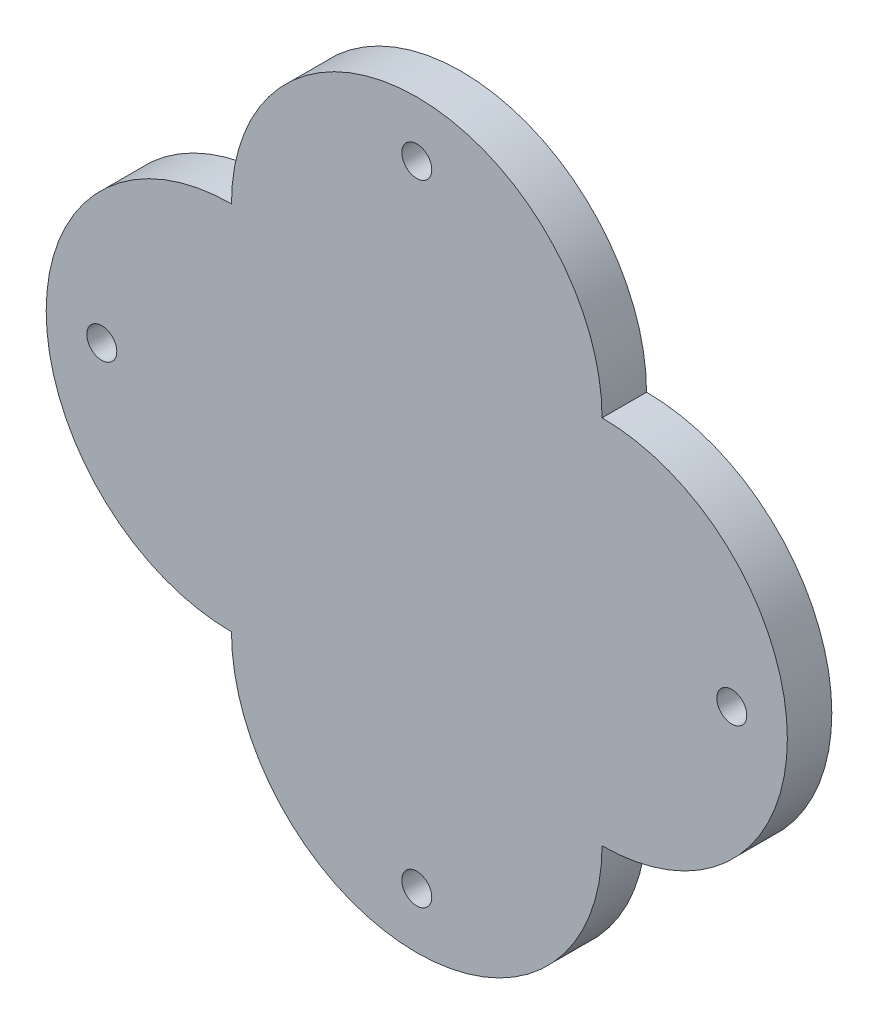
ISO-10303-21;
HEADER;
FILE_DESCRIPTION(('STEP AP214'),'2;1');
FILE_NAME('part.step','',(''),(''),'','','');
FILE_SCHEMA(('AUTOMOTIVE_DESIGN { 1 0 10303 214 1 1 1 1 }'));
ENDSEC;
DATA;
#1=APPLICATION_CONTEXT('core data for automotive mechanical design processes');
#2=APPLICATION_PROTOCOL_DEFINITION('international standard','automotive_design',2000,#1);
#3=PRODUCT_CONTEXT('',#1,'mechanical');
#4=PRODUCT('Part','Part','',(#3));
#5=PRODUCT_RELATED_PRODUCT_CATEGORY('part','',(#4));
#6=PRODUCT_DEFINITION_FORMATION('','',#4);
#7=PRODUCT_DEFINITION_CONTEXT('part definition',#1,'design');
#8=PRODUCT_DEFINITION('design','',#6,#7);
#9=PRODUCT_DEFINITION_SHAPE('','',#8);
#10=(LENGTH_UNIT() NAMED_UNIT(*) SI_UNIT(.MILLI.,.METRE.));
#11=(NAMED_UNIT(*) PLANE_ANGLE_UNIT() SI_UNIT($,.RADIAN.));
#12=(NAMED_UNIT(*) SI_UNIT($,.STERADIAN.) SOLID_ANGLE_UNIT());
#13=UNCERTAINTY_MEASURE_WITH_UNIT(LENGTH_MEASURE(1.E-05),#10,'distance_accuracy_value','');
#14=(GEOMETRIC_REPRESENTATION_CONTEXT(3) GLOBAL_UNCERTAINTY_ASSIGNED_CONTEXT((#13)) GLOBAL_UNIT_ASSIGNED_CONTEXT((#10,
#11,#12)) REPRESENTATION_CONTEXT('',''));
#15=CARTESIAN_POINT('',(0.,0.,0.));
#16=DIRECTION('',(0.,0.,1.));
#17=DIRECTION('',(1.,0.,0.));
#18=AXIS2_PLACEMENT_3D('',#15,#16,#17);
#19=CARTESIAN_POINT('',(-79.4444444444444,-4.40613026819923,12.));
#20=DIRECTION('',(0.,0.,-1.));
#21=DIRECTION('',(-1.,0.,0.));
#22=AXIS2_PLACEMENT_3D('',#19,#20,#21);
#23=CYLINDRICAL_SURFACE('',#22,9.49999999999999);
#24=CARTESIAN_POINT('',(-79.4444444444444,-4.40613026819923,0.));
#25=DIRECTION('',(0.,0.,1.));
#26=DIRECTION('',(1.,0.,0.));
#27=AXIS2_PLACEMENT_3D('',#24,#25,#26);
#28=CIRCLE('',#27,9.49999999999999);
#29=CARTESIAN_POINT('',(-69.9444444444444,-4.40613026819923,0.));
#30=VERTEX_POINT('',#29);
#31=EDGE_CURVE('E101',#30,#30,#28,.T.);
#32=ORIENTED_EDGE('',*,*,#31,.F.);
#33=EDGE_LOOP('',(#32));
#34=FACE_BOUND('',#33,.T.);
#35=CARTESIAN_POINT('',(-79.4444444444444,-4.40613026819923,6.));
#36=DIRECTION('',(0.,0.,1.));
#37=DIRECTION('',(1.,0.,0.));
#38=AXIS2_PLACEMENT_3D('',#35,#36,#37);
#39=CIRCLE('',#38,9.5);
#40=CARTESIAN_POINT('',(-69.9444444444444,-4.40613026819923,6.));
#41=VERTEX_POINT('',#40);
#42=EDGE_CURVE('E149',#41,#41,#39,.T.);
#43=ORIENTED_EDGE('',*,*,#42,.T.);
#44=EDGE_LOOP('',(#43));
#45=FACE_BOUND('',#44,.T.);
#46=ADVANCED_FACE('F33',(#34,#45),#23,.F.);
#47=CARTESIAN_POINT('',(5.55555555555558,-89.4061302681992,12.));
#48=DIRECTION('',(0.,0.,-1.));
#49=DIRECTION('',(-1.,0.,0.));
#50=AXIS2_PLACEMENT_3D('',#47,#48,#49);
#51=CYLINDRICAL_SURFACE('',#50,9.5);
#52=CARTESIAN_POINT('',(5.55555555555558,-89.4061302681992,0.));
#53=DIRECTION('',(0.,0.,1.));
#54=DIRECTION('',(1.,0.,0.));
#55=AXIS2_PLACEMENT_3D('',#52,#53,#54);
#56=CIRCLE('',#55,9.5);
#57=CARTESIAN_POINT('',(15.0555555555556,-89.4061302681992,0.));
#58=VERTEX_POINT('',#57);
#59=EDGE_CURVE('E121',#58,#58,#56,.T.);
#60=ORIENTED_EDGE('',*,*,#59,.F.);
#61=EDGE_LOOP('',(#60));
#62=FACE_BOUND('',#61,.T.);
#63=CARTESIAN_POINT('',(5.55555555555558,-89.4061302681992,6.));
#64=DIRECTION('',(0.,0.,1.));
#65=DIRECTION('',(1.,0.,0.));
#66=AXIS2_PLACEMENT_3D('',#63,#64,#65);
#67=CIRCLE('',#66,9.49999999999999);
#68=CARTESIAN_POINT('',(15.0555555555556,-89.4061302681992,6.));
#69=VERTEX_POINT('',#68);
#70=EDGE_CURVE('E140',#69,#69,#67,.T.);
#71=ORIENTED_EDGE('',*,*,#70,.T.);
#72=EDGE_LOOP('',(#71));
#73=FACE_BOUND('',#72,.T.);
#74=ADVANCED_FACE('F185',(#62,#73),#51,.F.);
#75=CARTESIAN_POINT('',(90.5555555555556,-4.40613026819923,12.));
#76=DIRECTION('',(0.,0.,-1.));
#77=DIRECTION('',(-1.,0.,0.));
#78=AXIS2_PLACEMENT_3D('',#75,#76,#77);
#79=CYLINDRICAL_SURFACE('',#78,9.49999999999999);
#80=CARTESIAN_POINT('',(90.5555555555556,-4.40613026819923,0.));
#81=DIRECTION('',(0.,0.,1.));
#82=DIRECTION('',(1.,0.,0.));
#83=AXIS2_PLACEMENT_3D('',#80,#81,#82);
#84=CIRCLE('',#83,9.49999999999999);
#85=CARTESIAN_POINT('',(100.055555555556,-4.40613026819923,0.));
#86=VERTEX_POINT('',#85);
#87=EDGE_CURVE('E118',#86,#86,#84,.T.);
#88=ORIENTED_EDGE('',*,*,#87,.F.);
#89=EDGE_LOOP('',(#88));
#90=FACE_BOUND('',#89,.T.);
#91=CARTESIAN_POINT('',(90.5555555555556,-4.40613026819923,6.));
#92=DIRECTION('',(0.,0.,1.));
#93=DIRECTION('',(1.,0.,0.));
#94=AXIS2_PLACEMENT_3D('',#91,#92,#93);
#95=CIRCLE('',#94,9.5);
#96=CARTESIAN_POINT('',(100.055555555556,-4.40613026819923,6.));
#97=VERTEX_POINT('',#96);
#98=EDGE_CURVE('E131',#97,#97,#95,.T.);
#99=ORIENTED_EDGE('',*,*,#98,.T.);
#100=EDGE_LOOP('',(#99));
#101=FACE_BOUND('',#100,.T.);
#102=ADVANCED_FACE('F180',(#90,#101),#79,.F.);
#103=CARTESIAN_POINT('',(5.55555555555557,80.5938697318008,12.));
#104=DIRECTION('',(0.,0.,-1.));
#105=DIRECTION('',(-1.,0.,0.));
#106=AXIS2_PLACEMENT_3D('',#103,#104,#105);
#107=CYLINDRICAL_SURFACE('',#106,9.5);
#108=CARTESIAN_POINT('',(5.55555555555557,80.5938697318008,0.));
#109=DIRECTION('',(0.,0.,1.));
#110=DIRECTION('',(1.,0.,0.));
#111=AXIS2_PLACEMENT_3D('',#108,#109,#110);
#112=CIRCLE('',#111,9.5);
#113=CARTESIAN_POINT('',(15.0555555555556,80.5938697318008,0.));
#114=VERTEX_POINT('',#113);
#115=EDGE_CURVE('E115',#114,#114,#112,.T.);
#116=ORIENTED_EDGE('',*,*,#115,.F.);
#117=EDGE_LOOP('',(#116));
#118=FACE_BOUND('',#117,.T.);
#119=CARTESIAN_POINT('',(5.55555555555557,80.5938697318008,6.));
#120=DIRECTION('',(0.,0.,1.));
#121=DIRECTION('',(1.,0.,0.));
#122=AXIS2_PLACEMENT_3D('',#119,#120,#121);
#123=CIRCLE('',#122,9.50000000000001);
#124=CARTESIAN_POINT('',(15.0555555555556,80.5938697318008,6.));
#125=VERTEX_POINT('',#124);
#126=EDGE_CURVE('E124',#125,#125,#123,.T.);
#127=ORIENTED_EDGE('',*,*,#126,.T.);
#128=EDGE_LOOP('',(#127));
#129=FACE_BOUND('',#128,.T.);
#130=ADVANCED_FACE('F171',(#118,#129),#107,.F.);
#131=CARTESIAN_POINT('',(-19.4444444444444,-29.4061302681992,12.));
#132=DIRECTION('',(0.,0.,1.));
#133=DIRECTION('',(1.,0.,0.));
#134=AXIS2_PLACEMENT_3D('',#131,#132,#133);
#135=PLANE('',#134);
#136=CARTESIAN_POINT('',(-44.4444444444444,-4.40613026819923,12.));
#137=DIRECTION('',(0.,0.,1.));
#138=DIRECTION('',(1.,0.,0.));
#139=AXIS2_PLACEMENT_3D('',#136,#137,#138);
#140=CIRCLE('',#139,50.);
#141=CARTESIAN_POINT('',(-44.4444444444444,45.5938697318008,12.));
#142=VERTEX_POINT('',#141);
#143=CARTESIAN_POINT('',(-44.4444444444444,-54.4061302681992,12.));
#144=VERTEX_POINT('',#143);
#145=EDGE_CURVE('E86',#142,#144,#140,.T.);
#146=ORIENTED_EDGE('',*,*,#145,.T.);
#147=CARTESIAN_POINT('',(5.55555555555558,-54.4061302681992,12.));
#148=DIRECTION('',(0.,0.,1.));
#149=DIRECTION('',(1.,0.,0.));
#150=AXIS2_PLACEMENT_3D('',#147,#148,#149);
#151=CIRCLE('',#150,50.);
#152=CARTESIAN_POINT('',(55.5555555555556,-54.4061302681992,12.));
#153=VERTEX_POINT('',#152);
#154=EDGE_CURVE('E80',#144,#153,#151,.T.);
#155=ORIENTED_EDGE('',*,*,#154,.T.);
#156=CARTESIAN_POINT('',(55.5555555555556,-4.40613026819923,12.));
#157=DIRECTION('',(0.,0.,1.));
#158=DIRECTION('',(1.,0.,0.));
#159=AXIS2_PLACEMENT_3D('',#156,#157,#158);
#160=CIRCLE('',#159,50.);
#161=CARTESIAN_POINT('',(55.5555555555556,45.5938697318008,12.));
#162=VERTEX_POINT('',#161);
#163=EDGE_CURVE('E84',#153,#162,#160,.T.);
#164=ORIENTED_EDGE('',*,*,#163,.T.);
#165=CARTESIAN_POINT('',(5.55555555555557,45.5938697318008,12.));
#166=DIRECTION('',(0.,0.,1.));
#167=DIRECTION('',(1.,0.,0.));
#168=AXIS2_PLACEMENT_3D('',#165,#166,#167);
#169=CIRCLE('',#168,50.);
#170=EDGE_CURVE('E50',#162,#142,#169,.T.);
#171=ORIENTED_EDGE('',*,*,#170,.T.);
#172=EDGE_LOOP('',(#146,#155,#164,#171));
#173=FACE_BOUND('',#172,.T.);
#174=CARTESIAN_POINT('',(5.55555555555557,80.5938697318008,12.));
#175=DIRECTION('',(0.,0.,1.));
#176=DIRECTION('',(1.,0.,0.));
#177=AXIS2_PLACEMENT_3D('',#174,#175,#176);
#178=CIRCLE('',#177,4.05);
#179=CARTESIAN_POINT('',(9.60555555555557,80.5938697318008,12.));
#180=VERTEX_POINT('',#179);
#181=EDGE_CURVE('E128',#180,#180,#178,.T.);
#182=ORIENTED_EDGE('',*,*,#181,.F.);
#183=EDGE_LOOP('',(#182));
#184=FACE_BOUND('',#183,.T.);
#185=CARTESIAN_POINT('',(90.5555555555556,-4.40613026819923,12.));
#186=DIRECTION('',(0.,0.,1.));
#187=DIRECTION('',(1.,0.,0.));
#188=AXIS2_PLACEMENT_3D('',#185,#186,#187);
#189=CIRCLE('',#188,4.05);
#190=CARTESIAN_POINT('',(94.6055555555556,-4.40613026819923,12.));
#191=VERTEX_POINT('',#190);
#192=EDGE_CURVE('E137',#191,#191,#189,.T.);
#193=ORIENTED_EDGE('',*,*,#192,.F.);
#194=EDGE_LOOP('',(#193));
#195=FACE_BOUND('',#194,.T.);
#196=CARTESIAN_POINT('',(5.55555555555558,-89.4061302681992,12.));
#197=DIRECTION('',(0.,0.,1.));
#198=DIRECTION('',(1.,0.,0.));
#199=AXIS2_PLACEMENT_3D('',#196,#197,#198);
#200=CIRCLE('',#199,4.05);
#201=CARTESIAN_POINT('',(9.60555555555558,-89.4061302681992,12.));
#202=VERTEX_POINT('',#201);
#203=EDGE_CURVE('E146',#202,#202,#200,.T.);
#204=ORIENTED_EDGE('',*,*,#203,.F.);
#205=EDGE_LOOP('',(#204));
#206=FACE_BOUND('',#205,.T.);
#207=CARTESIAN_POINT('',(-79.4444444444444,-4.40613026819923,12.));
#208=DIRECTION('',(0.,0.,1.));
#209=DIRECTION('',(1.,0.,0.));
#210=AXIS2_PLACEMENT_3D('',#207,#208,#209);
#211=CIRCLE('',#210,4.05);
#212=CARTESIAN_POINT('',(-75.3944444444444,-4.40613026819923,12.));
#213=VERTEX_POINT('',#212);
#214=EDGE_CURVE('E155',#213,#213,#211,.T.);
#215=ORIENTED_EDGE('',*,*,#214,.F.);
#216=EDGE_LOOP('',(#215));
#217=FACE_BOUND('',#216,.T.);
#218=ADVANCED_FACE('F81',(#173,#184,#195,#206,#217),#135,.T.);
#219=CARTESIAN_POINT('',(-19.4444444444444,-29.4061302681992,0.));
#220=DIRECTION('',(0.,0.,1.));
#221=DIRECTION('',(1.,0.,0.));
#222=AXIS2_PLACEMENT_3D('',#219,#220,#221);
#223=PLANE('',#222);
#224=CARTESIAN_POINT('',(-44.4444444444444,-4.40613026819923,0.));
#225=DIRECTION('',(0.,0.,1.));
#226=DIRECTION('',(1.,0.,0.));
#227=AXIS2_PLACEMENT_3D('',#224,#225,#226);
#228=CIRCLE('',#227,50.);
#229=CARTESIAN_POINT('',(-44.4444444444444,45.5938697318008,0.));
#230=VERTEX_POINT('',#229);
#231=CARTESIAN_POINT('',(-44.4444444444444,-54.4061302681992,0.));
#232=VERTEX_POINT('',#231);
#233=EDGE_CURVE('E98',#230,#232,#228,.T.);
#234=ORIENTED_EDGE('',*,*,#233,.F.);
#235=CARTESIAN_POINT('',(5.55555555555557,45.5938697318008,0.));
#236=DIRECTION('',(0.,0.,1.));
#237=DIRECTION('',(1.,0.,0.));
#238=AXIS2_PLACEMENT_3D('',#235,#236,#237);
#239=CIRCLE('',#238,50.);
#240=CARTESIAN_POINT('',(55.5555555555556,45.5938697318008,0.));
#241=VERTEX_POINT('',#240);
#242=EDGE_CURVE('E73',#241,#230,#239,.T.);
#243=ORIENTED_EDGE('',*,*,#242,.F.);
#244=CARTESIAN_POINT('',(55.5555555555556,-4.40613026819923,0.));
#245=DIRECTION('',(0.,0.,1.));
#246=DIRECTION('',(1.,0.,0.));
#247=AXIS2_PLACEMENT_3D('',#244,#245,#246);
#248=CIRCLE('',#247,50.);
#249=CARTESIAN_POINT('',(55.5555555555556,-54.4061302681992,0.));
#250=VERTEX_POINT('',#249);
#251=EDGE_CURVE('E67',#250,#241,#248,.T.);
#252=ORIENTED_EDGE('',*,*,#251,.F.);
#253=CARTESIAN_POINT('',(5.55555555555558,-54.4061302681992,0.));
#254=DIRECTION('',(0.,0.,1.));
#255=DIRECTION('',(1.,0.,0.));
#256=AXIS2_PLACEMENT_3D('',#253,#254,#255);
#257=CIRCLE('',#256,50.);
#258=EDGE_CURVE('E90',#232,#250,#257,.T.);
#259=ORIENTED_EDGE('',*,*,#258,.F.);
#260=EDGE_LOOP('',(#234,#243,#252,#259));
#261=FACE_BOUND('',#260,.T.);
#262=ORIENTED_EDGE('',*,*,#31,.T.);
#263=EDGE_LOOP('',(#262));
#264=FACE_BOUND('',#263,.T.);
#265=ORIENTED_EDGE('',*,*,#115,.T.);
#266=EDGE_LOOP('',(#265));
#267=FACE_BOUND('',#266,.T.);
#268=ORIENTED_EDGE('',*,*,#87,.T.);
#269=EDGE_LOOP('',(#268));
#270=FACE_BOUND('',#269,.T.);
#271=ORIENTED_EDGE('',*,*,#59,.T.);
#272=EDGE_LOOP('',(#271));
#273=FACE_BOUND('',#272,.T.);
#274=ADVANCED_FACE('F109',(#261,#264,#267,#270,#273),#223,.F.);
#275=CARTESIAN_POINT('',(-44.4444444444444,-4.40613026819923,12.));
#276=DIRECTION('',(0.,0.,-1.));
#277=DIRECTION('',(-1.,0.,0.));
#278=AXIS2_PLACEMENT_3D('',#275,#276,#277);
#279=CYLINDRICAL_SURFACE('',#278,50.);
#280=ORIENTED_EDGE('',*,*,#233,.T.);
#281=DIRECTION('',(0.,0.,-1.));
#282=VECTOR('',#281,1.);
#283=CARTESIAN_POINT('',(-44.4444444444444,-54.4061302681992,12.));
#284=LINE('',#283,#282);
#285=EDGE_CURVE('E11',#144,#232,#284,.T.);
#286=ORIENTED_EDGE('',*,*,#285,.F.);
#287=ORIENTED_EDGE('',*,*,#145,.F.);
#288=DIRECTION('',(0.,0.,-1.));
#289=VECTOR('',#288,1.);
#290=CARTESIAN_POINT('',(-44.4444444444444,45.5938697318008,12.));
#291=LINE('',#290,#289);
#292=EDGE_CURVE('E94',#142,#230,#291,.T.);
#293=ORIENTED_EDGE('',*,*,#292,.T.);
#294=EDGE_LOOP('',(#280,#286,#287,#293));
#295=FACE_BOUND('',#294,.T.);
#296=ADVANCED_FACE('F35',(#295),#279,.T.);
#297=CARTESIAN_POINT('',(5.55555555555558,-54.4061302681992,12.));
#298=DIRECTION('',(0.,0.,-1.));
#299=DIRECTION('',(-1.,0.,0.));
#300=AXIS2_PLACEMENT_3D('',#297,#298,#299);
#301=CYLINDRICAL_SURFACE('',#300,50.);
#302=ORIENTED_EDGE('',*,*,#258,.T.);
#303=DIRECTION('',(0.,0.,-1.));
#304=VECTOR('',#303,1.);
#305=CARTESIAN_POINT('',(55.5555555555556,-54.4061302681992,12.));
#306=LINE('',#305,#304);
#307=EDGE_CURVE('E42',#153,#250,#306,.T.);
#308=ORIENTED_EDGE('',*,*,#307,.F.);
#309=ORIENTED_EDGE('',*,*,#154,.F.);
#310=ORIENTED_EDGE('',*,*,#285,.T.);
#311=EDGE_LOOP('',(#302,#308,#309,#310));
#312=FACE_BOUND('',#311,.T.);
#313=ADVANCED_FACE('F89',(#312),#301,.T.);
#314=CARTESIAN_POINT('',(55.5555555555556,-4.40613026819923,12.));
#315=DIRECTION('',(0.,0.,-1.));
#316=DIRECTION('',(-1.,0.,0.));
#317=AXIS2_PLACEMENT_3D('',#314,#315,#316);
#318=CYLINDRICAL_SURFACE('',#317,50.);
#319=ORIENTED_EDGE('',*,*,#251,.T.);
#320=DIRECTION('',(0.,0.,-1.));
#321=VECTOR('',#320,1.);
#322=CARTESIAN_POINT('',(55.5555555555556,45.5938697318008,12.));
#323=LINE('',#322,#321);
#324=EDGE_CURVE('E91',#162,#241,#323,.T.);
#325=ORIENTED_EDGE('',*,*,#324,.F.);
#326=ORIENTED_EDGE('',*,*,#163,.F.);
#327=ORIENTED_EDGE('',*,*,#307,.T.);
#328=EDGE_LOOP('',(#319,#325,#326,#327));
#329=FACE_BOUND('',#328,.T.);
#330=ADVANCED_FACE('F92',(#329),#318,.T.);
#331=CARTESIAN_POINT('',(5.55555555555557,45.5938697318008,12.));
#332=DIRECTION('',(0.,0.,-1.));
#333=DIRECTION('',(-1.,0.,0.));
#334=AXIS2_PLACEMENT_3D('',#331,#332,#333);
#335=CYLINDRICAL_SURFACE('',#334,50.);
#336=ORIENTED_EDGE('',*,*,#242,.T.);
#337=ORIENTED_EDGE('',*,*,#292,.F.);
#338=ORIENTED_EDGE('',*,*,#170,.F.);
#339=ORIENTED_EDGE('',*,*,#324,.T.);
#340=EDGE_LOOP('',(#336,#337,#338,#339));
#341=FACE_BOUND('',#340,.T.);
#342=ADVANCED_FACE('F106',(#341),#335,.T.);
#343=CARTESIAN_POINT('',(5.55555555555557,80.5938697318008,6.));
#344=DIRECTION('',(0.,0.,1.));
#345=DIRECTION('',(1.,0.,0.));
#346=AXIS2_PLACEMENT_3D('',#343,#344,#345);
#347=PLANE('',#346);
#348=CARTESIAN_POINT('',(5.55555555555557,80.5938697318008,6.));
#349=DIRECTION('',(0.,0.,1.));
#350=DIRECTION('',(1.,0.,0.));
#351=AXIS2_PLACEMENT_3D('',#348,#349,#350);
#352=CIRCLE('',#351,4.05);
#353=CARTESIAN_POINT('',(9.60555555555557,80.5938697318008,6.));
#354=VERTEX_POINT('',#353);
#355=EDGE_CURVE('E127',#354,#354,#352,.T.);
#356=ORIENTED_EDGE('',*,*,#355,.T.);
#357=EDGE_LOOP('',(#356));
#358=FACE_BOUND('',#357,.T.);
#359=ORIENTED_EDGE('',*,*,#126,.F.);
#360=EDGE_LOOP('',(#359));
#361=FACE_BOUND('',#360,.T.);
#362=ADVANCED_FACE('F199',(#358,#361),#347,.F.);
#363=CARTESIAN_POINT('',(5.55555555555557,80.5938697318008,6.));
#364=DIRECTION('',(0.,0.,1.));
#365=DIRECTION('',(1.,0.,0.));
#366=AXIS2_PLACEMENT_3D('',#363,#364,#365);
#367=CYLINDRICAL_SURFACE('',#366,4.05);
#368=ORIENTED_EDGE('',*,*,#355,.F.);
#369=EDGE_LOOP('',(#368));
#370=FACE_BOUND('',#369,.T.);
#371=ORIENTED_EDGE('',*,*,#181,.T.);
#372=EDGE_LOOP('',(#371));
#373=FACE_BOUND('',#372,.T.);
#374=ADVANCED_FACE('F201',(#370,#373),#367,.F.);
#375=CARTESIAN_POINT('',(90.5555555555556,-4.40613026819923,6.));
#376=DIRECTION('',(0.,0.,1.));
#377=DIRECTION('',(1.,0.,0.));
#378=AXIS2_PLACEMENT_3D('',#375,#376,#377);
#379=PLANE('',#378);
#380=CARTESIAN_POINT('',(90.5555555555556,-4.40613026819923,6.));
#381=DIRECTION('',(0.,0.,1.));
#382=DIRECTION('',(1.,0.,0.));
#383=AXIS2_PLACEMENT_3D('',#380,#381,#382);
#384=CIRCLE('',#383,4.05);
#385=CARTESIAN_POINT('',(94.6055555555556,-4.40613026819923,6.));
#386=VERTEX_POINT('',#385);
#387=EDGE_CURVE('E136',#386,#386,#384,.T.);
#388=ORIENTED_EDGE('',*,*,#387,.T.);
#389=EDGE_LOOP('',(#388));
#390=FACE_BOUND('',#389,.T.);
#391=ORIENTED_EDGE('',*,*,#98,.F.);
#392=EDGE_LOOP('',(#391));
#393=FACE_BOUND('',#392,.T.);
#394=ADVANCED_FACE('F205',(#390,#393),#379,.F.);
#395=CARTESIAN_POINT('',(90.5555555555556,-4.40613026819923,6.));
#396=DIRECTION('',(0.,0.,1.));
#397=DIRECTION('',(1.,0.,0.));
#398=AXIS2_PLACEMENT_3D('',#395,#396,#397);
#399=CYLINDRICAL_SURFACE('',#398,4.05);
#400=ORIENTED_EDGE('',*,*,#387,.F.);
#401=EDGE_LOOP('',(#400));
#402=FACE_BOUND('',#401,.T.);
#403=ORIENTED_EDGE('',*,*,#192,.T.);
#404=EDGE_LOOP('',(#403));
#405=FACE_BOUND('',#404,.T.);
#406=ADVANCED_FACE('F209',(#402,#405),#399,.F.);
#407=CARTESIAN_POINT('',(5.55555555555558,-89.4061302681992,6.));
#408=DIRECTION('',(0.,0.,1.));
#409=DIRECTION('',(1.,0.,0.));
#410=AXIS2_PLACEMENT_3D('',#407,#408,#409);
#411=PLANE('',#410);
#412=CARTESIAN_POINT('',(5.55555555555558,-89.4061302681992,6.));
#413=DIRECTION('',(0.,0.,1.));
#414=DIRECTION('',(1.,0.,0.));
#415=AXIS2_PLACEMENT_3D('',#412,#413,#414);
#416=CIRCLE('',#415,4.05);
#417=CARTESIAN_POINT('',(9.60555555555558,-89.4061302681992,6.));
#418=VERTEX_POINT('',#417);
#419=EDGE_CURVE('E145',#418,#418,#416,.T.);
#420=ORIENTED_EDGE('',*,*,#419,.T.);
#421=EDGE_LOOP('',(#420));
#422=FACE_BOUND('',#421,.T.);
#423=ORIENTED_EDGE('',*,*,#70,.F.);
#424=EDGE_LOOP('',(#423));
#425=FACE_BOUND('',#424,.T.);
#426=ADVANCED_FACE('F213',(#422,#425),#411,.F.);
#427=CARTESIAN_POINT('',(5.55555555555558,-89.4061302681992,6.));
#428=DIRECTION('',(0.,0.,1.));
#429=DIRECTION('',(1.,0.,0.));
#430=AXIS2_PLACEMENT_3D('',#427,#428,#429);
#431=CYLINDRICAL_SURFACE('',#430,4.05);
#432=ORIENTED_EDGE('',*,*,#419,.F.);
#433=EDGE_LOOP('',(#432));
#434=FACE_BOUND('',#433,.T.);
#435=ORIENTED_EDGE('',*,*,#203,.T.);
#436=EDGE_LOOP('',(#435));
#437=FACE_BOUND('',#436,.T.);
#438=ADVANCED_FACE('F217',(#434,#437),#431,.F.);
#439=CARTESIAN_POINT('',(-79.4444444444444,-4.40613026819923,6.));
#440=DIRECTION('',(0.,0.,1.));
#441=DIRECTION('',(1.,0.,0.));
#442=AXIS2_PLACEMENT_3D('',#439,#440,#441);
#443=PLANE('',#442);
#444=CARTESIAN_POINT('',(-79.4444444444444,-4.40613026819923,6.));
#445=DIRECTION('',(0.,0.,1.));
#446=DIRECTION('',(1.,0.,0.));
#447=AXIS2_PLACEMENT_3D('',#444,#445,#446);
#448=CIRCLE('',#447,4.05);
#449=CARTESIAN_POINT('',(-75.3944444444444,-4.40613026819923,6.));
#450=VERTEX_POINT('',#449);
#451=EDGE_CURVE('E154',#450,#450,#448,.T.);
#452=ORIENTED_EDGE('',*,*,#451,.T.);
#453=EDGE_LOOP('',(#452));
#454=FACE_BOUND('',#453,.T.);
#455=ORIENTED_EDGE('',*,*,#42,.F.);
#456=EDGE_LOOP('',(#455));
#457=FACE_BOUND('',#456,.T.);
#458=ADVANCED_FACE('F161',(#454,#457),#443,.F.);
#459=CARTESIAN_POINT('',(-79.4444444444444,-4.40613026819923,6.));
#460=DIRECTION('',(0.,0.,1.));
#461=DIRECTION('',(1.,0.,0.));
#462=AXIS2_PLACEMENT_3D('',#459,#460,#461);
#463=CYLINDRICAL_SURFACE('',#462,4.05);
#464=ORIENTED_EDGE('',*,*,#451,.F.);
#465=EDGE_LOOP('',(#464));
#466=FACE_BOUND('',#465,.T.);
#467=ORIENTED_EDGE('',*,*,#214,.T.);
#468=EDGE_LOOP('',(#467));
#469=FACE_BOUND('',#468,.T.);
#470=ADVANCED_FACE('F164',(#466,#469),#463,.F.);
#471=CLOSED_SHELL('',(#46,#74,#102,#130,#218,#274,#296,#313,#330,#342,#362,#374,#394,#406,#426,
#438,#458,#470));
#472=MANIFOLD_SOLID_BREP('B2',#471);
#473=ADVANCED_BREP_SHAPE_REPRESENTATION('',(#18,#472),#14);
#474=SHAPE_DEFINITION_REPRESENTATION(#9,#473);
ENDSEC;
END-ISO-10303-21;
